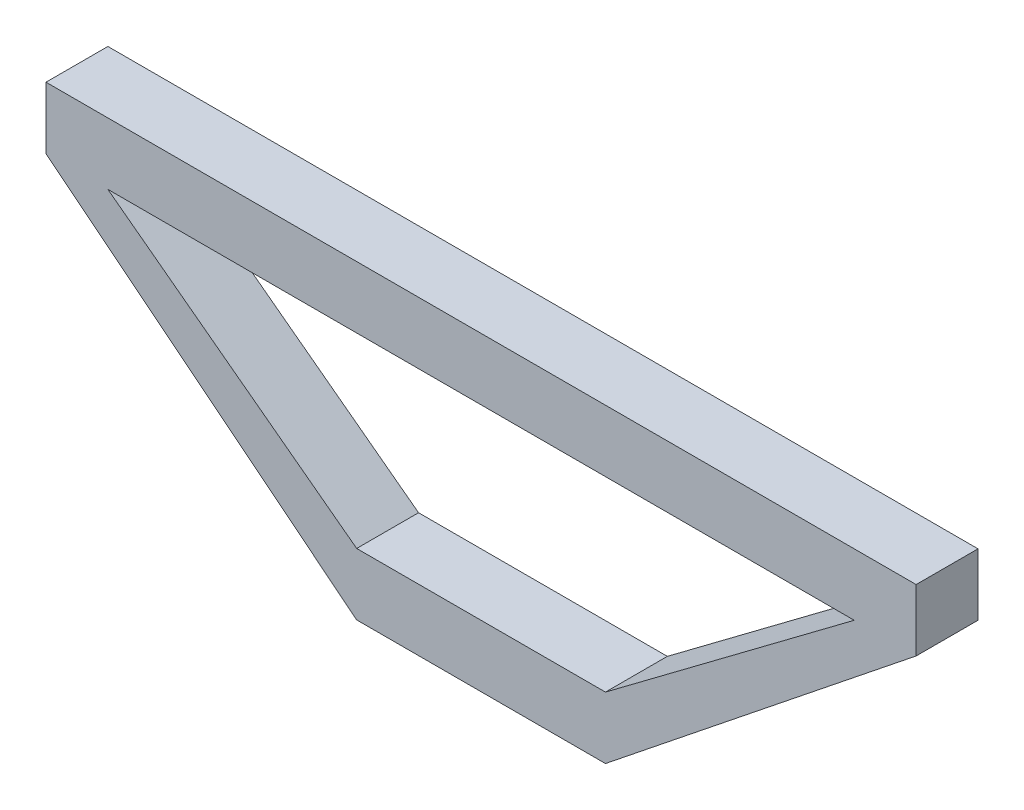
ISO-10303-21;
HEADER;
FILE_DESCRIPTION(('STEP AP214'),'2;1');
FILE_NAME('part.step','',(''),(''),'','','');
FILE_SCHEMA(('AUTOMOTIVE_DESIGN { 1 0 10303 214 1 1 1 1 }'));
ENDSEC;
DATA;
#1=APPLICATION_CONTEXT('core data for automotive mechanical design processes');
#2=APPLICATION_PROTOCOL_DEFINITION('international standard','automotive_design',2000,#1);
#3=PRODUCT_CONTEXT('',#1,'mechanical');
#4=PRODUCT('Part','Part','',(#3));
#5=PRODUCT_RELATED_PRODUCT_CATEGORY('part','',(#4));
#6=PRODUCT_DEFINITION_FORMATION('','',#4);
#7=PRODUCT_DEFINITION_CONTEXT('part definition',#1,'design');
#8=PRODUCT_DEFINITION('design','',#6,#7);
#9=PRODUCT_DEFINITION_SHAPE('','',#8);
#10=(LENGTH_UNIT() NAMED_UNIT(*) SI_UNIT(.MILLI.,.METRE.));
#11=(NAMED_UNIT(*) PLANE_ANGLE_UNIT() SI_UNIT($,.RADIAN.));
#12=(NAMED_UNIT(*) SI_UNIT($,.STERADIAN.) SOLID_ANGLE_UNIT());
#13=UNCERTAINTY_MEASURE_WITH_UNIT(LENGTH_MEASURE(1.E-05),#10,'distance_accuracy_value','');
#14=(GEOMETRIC_REPRESENTATION_CONTEXT(3) GLOBAL_UNCERTAINTY_ASSIGNED_CONTEXT((#13)) GLOBAL_UNIT_ASSIGNED_CONTEXT((#10,
#11,#12)) REPRESENTATION_CONTEXT('',''));
#15=CARTESIAN_POINT('',(0.,0.,0.));
#16=DIRECTION('',(0.,0.,1.));
#17=DIRECTION('',(1.,0.,0.));
#18=AXIS2_PLACEMENT_3D('',#15,#16,#17);
#19=CARTESIAN_POINT('',(0.,0.,99.5));
#20=DIRECTION('',(0.,0.,-1.));
#21=DIRECTION('',(-1.,0.,0.));
#22=AXIS2_PLACEMENT_3D('',#19,#20,#21);
#23=PLANE('',#22);
#24=DIRECTION('',(0.,1.,0.));
#25=VECTOR('',#24,1.);
#26=CARTESIAN_POINT('',(-499.5,300.,99.5));
#27=LINE('',#26,#25);
#28=CARTESIAN_POINT('',(-499.5,300.,99.5));
#29=VERTEX_POINT('',#28);
#30=CARTESIAN_POINT('',(-499.5,399.5,99.5));
#31=VERTEX_POINT('',#30);
#32=EDGE_CURVE('E173',#29,#31,#27,.T.);
#33=ORIENTED_EDGE('',*,*,#32,.F.);
#34=DIRECTION('',(-0.780945069652606,0.624599710362794,0.));
#35=VECTOR('',#34,1.);
#36=CARTESIAN_POINT('',(0.,-99.5,99.5));
#37=LINE('',#36,#35);
#38=CARTESIAN_POINT('',(0.,-99.5,99.5));
#39=VERTEX_POINT('',#38);
#40=EDGE_CURVE('E192',#39,#29,#37,.T.);
#41=ORIENTED_EDGE('',*,*,#40,.F.);
#42=DIRECTION('',(1.,0.,0.));
#43=VECTOR('',#42,1.);
#44=CARTESIAN_POINT('',(0.,-99.5,99.5));
#45=LINE('',#44,#43);
#46=CARTESIAN_POINT('',(400.,-99.5,99.5));
#47=VERTEX_POINT('',#46);
#48=EDGE_CURVE('E189',#39,#47,#45,.T.);
#49=ORIENTED_EDGE('',*,*,#48,.T.);
#50=DIRECTION('',(0.780945069652606,0.624599710362794,0.));
#51=VECTOR('',#50,1.);
#52=CARTESIAN_POINT('',(400.,-99.5,99.5));
#53=LINE('',#52,#51);
#54=CARTESIAN_POINT('',(899.5,300.,99.5));
#55=VERTEX_POINT('',#54);
#56=EDGE_CURVE('E186',#47,#55,#53,.T.);
#57=ORIENTED_EDGE('',*,*,#56,.T.);
#58=DIRECTION('',(0.,-1.,0.));
#59=VECTOR('',#58,1.);
#60=CARTESIAN_POINT('',(899.5,399.5,99.5));
#61=LINE('',#60,#59);
#62=CARTESIAN_POINT('',(899.5,399.5,99.5));
#63=VERTEX_POINT('',#62);
#64=EDGE_CURVE('E182',#63,#55,#61,.T.);
#65=ORIENTED_EDGE('',*,*,#64,.F.);
#66=DIRECTION('',(1.,0.,0.));
#67=VECTOR('',#66,1.);
#68=CARTESIAN_POINT('',(-499.5,399.5,99.5));
#69=LINE('',#68,#67);
#70=EDGE_CURVE('E177',#31,#63,#69,.T.);
#71=ORIENTED_EDGE('',*,*,#70,.F.);
#72=EDGE_LOOP('',(#33,#41,#49,#57,#65,#71));
#73=FACE_BOUND('',#72,.T.);
#74=DIRECTION('',(0.8,-0.6,0.));
#75=VECTOR('',#74,1.);
#76=CARTESIAN_POINT('',(0.,0.,99.5));
#77=LINE('',#76,#75);
#78=CARTESIAN_POINT('',(-400.,300.,99.5));
#79=VERTEX_POINT('',#78);
#80=CARTESIAN_POINT('',(0.,0.,99.5));
#81=VERTEX_POINT('',#80);
#82=EDGE_CURVE('E125',#79,#81,#77,.T.);
#83=ORIENTED_EDGE('',*,*,#82,.F.);
#84=DIRECTION('',(-1.,0.,0.));
#85=VECTOR('',#84,1.);
#86=CARTESIAN_POINT('',(-400.,300.,99.5));
#87=LINE('',#86,#85);
#88=CARTESIAN_POINT('',(800.,300.,99.5));
#89=VERTEX_POINT('',#88);
#90=EDGE_CURVE('E151',#89,#79,#87,.T.);
#91=ORIENTED_EDGE('',*,*,#90,.F.);
#92=DIRECTION('',(0.8,0.6,0.));
#93=VECTOR('',#92,1.);
#94=CARTESIAN_POINT('',(400.,0.,99.5));
#95=LINE('',#94,#93);
#96=CARTESIAN_POINT('',(400.,0.,99.5));
#97=VERTEX_POINT('',#96);
#98=EDGE_CURVE('E147',#97,#89,#95,.T.);
#99=ORIENTED_EDGE('',*,*,#98,.F.);
#100=DIRECTION('',(1.,0.,0.));
#101=VECTOR('',#100,1.);
#102=CARTESIAN_POINT('',(0.,0.,99.5));
#103=LINE('',#102,#101);
#104=EDGE_CURVE('E134',#81,#97,#103,.T.);
#105=ORIENTED_EDGE('',*,*,#104,.F.);
#106=EDGE_LOOP('',(#83,#91,#99,#105));
#107=FACE_BOUND('',#106,.T.);
#108=ADVANCED_FACE('F46',(#73,#107),#23,.F.);
#109=CARTESIAN_POINT('',(0.,0.,0.));
#110=DIRECTION('',(0.,0.,-1.));
#111=DIRECTION('',(-1.,0.,0.));
#112=AXIS2_PLACEMENT_3D('',#109,#110,#111);
#113=PLANE('',#112);
#114=DIRECTION('',(0.,1.,0.));
#115=VECTOR('',#114,1.);
#116=CARTESIAN_POINT('',(-499.5,300.,0.));
#117=LINE('',#116,#115);
#118=CARTESIAN_POINT('',(-499.5,300.,0.));
#119=VERTEX_POINT('',#118);
#120=CARTESIAN_POINT('',(-499.5,399.5,0.));
#121=VERTEX_POINT('',#120);
#122=EDGE_CURVE('E143',#119,#121,#117,.T.);
#123=ORIENTED_EDGE('',*,*,#122,.T.);
#124=DIRECTION('',(1.,0.,0.));
#125=VECTOR('',#124,1.);
#126=CARTESIAN_POINT('',(-499.5,399.5,0.));
#127=LINE('',#126,#125);
#128=CARTESIAN_POINT('',(899.5,399.5,0.));
#129=VERTEX_POINT('',#128);
#130=EDGE_CURVE('E199',#121,#129,#127,.T.);
#131=ORIENTED_EDGE('',*,*,#130,.T.);
#132=DIRECTION('',(0.,-1.,0.));
#133=VECTOR('',#132,1.);
#134=CARTESIAN_POINT('',(899.5,399.5,0.));
#135=LINE('',#134,#133);
#136=CARTESIAN_POINT('',(899.5,300.,0.));
#137=VERTEX_POINT('',#136);
#138=EDGE_CURVE('E203',#129,#137,#135,.T.);
#139=ORIENTED_EDGE('',*,*,#138,.T.);
#140=DIRECTION('',(0.780945069652606,0.624599710362794,0.));
#141=VECTOR('',#140,1.);
#142=CARTESIAN_POINT('',(400.,-99.5,0.));
#143=LINE('',#142,#141);
#144=CARTESIAN_POINT('',(400.,-99.5,0.));
#145=VERTEX_POINT('',#144);
#146=EDGE_CURVE('E207',#145,#137,#143,.T.);
#147=ORIENTED_EDGE('',*,*,#146,.F.);
#148=DIRECTION('',(1.,0.,0.));
#149=VECTOR('',#148,1.);
#150=CARTESIAN_POINT('',(0.,-99.5,0.));
#151=LINE('',#150,#149);
#152=CARTESIAN_POINT('',(0.,-99.5,0.));
#153=VERTEX_POINT('',#152);
#154=EDGE_CURVE('E211',#153,#145,#151,.T.);
#155=ORIENTED_EDGE('',*,*,#154,.F.);
#156=DIRECTION('',(-0.780945069652606,0.624599710362794,0.));
#157=VECTOR('',#156,1.);
#158=CARTESIAN_POINT('',(0.,-99.5,0.));
#159=LINE('',#158,#157);
#160=EDGE_CURVE('E178',#153,#119,#159,.T.);
#161=ORIENTED_EDGE('',*,*,#160,.T.);
#162=EDGE_LOOP('',(#123,#131,#139,#147,#155,#161));
#163=FACE_BOUND('',#162,.T.);
#164=DIRECTION('',(-1.,0.,0.));
#165=VECTOR('',#164,1.);
#166=CARTESIAN_POINT('',(-400.,300.,0.));
#167=LINE('',#166,#165);
#168=CARTESIAN_POINT('',(800.,300.,0.));
#169=VERTEX_POINT('',#168);
#170=CARTESIAN_POINT('',(-400.,300.,0.));
#171=VERTEX_POINT('',#170);
#172=EDGE_CURVE('E135',#169,#171,#167,.T.);
#173=ORIENTED_EDGE('',*,*,#172,.T.);
#174=DIRECTION('',(0.8,-0.6,0.));
#175=VECTOR('',#174,1.);
#176=CARTESIAN_POINT('',(0.,0.,0.));
#177=LINE('',#176,#175);
#178=CARTESIAN_POINT('',(0.,0.,0.));
#179=VERTEX_POINT('',#178);
#180=EDGE_CURVE('E72',#171,#179,#177,.T.);
#181=ORIENTED_EDGE('',*,*,#180,.T.);
#182=DIRECTION('',(1.,0.,0.));
#183=VECTOR('',#182,1.);
#184=CARTESIAN_POINT('',(0.,0.,0.));
#185=LINE('',#184,#183);
#186=CARTESIAN_POINT('',(400.,0.,0.));
#187=VERTEX_POINT('',#186);
#188=EDGE_CURVE('E141',#179,#187,#185,.T.);
#189=ORIENTED_EDGE('',*,*,#188,.T.);
#190=DIRECTION('',(0.8,0.6,0.));
#191=VECTOR('',#190,1.);
#192=CARTESIAN_POINT('',(400.,0.,0.));
#193=LINE('',#192,#191);
#194=EDGE_CURVE('E160',#187,#169,#193,.T.);
#195=ORIENTED_EDGE('',*,*,#194,.T.);
#196=EDGE_LOOP('',(#173,#181,#189,#195));
#197=FACE_BOUND('',#196,.T.);
#198=ADVANCED_FACE('F237',(#163,#197),#113,.T.);
#199=CARTESIAN_POINT('',(-499.5,300.,99.5));
#200=DIRECTION('',(-1.,0.,0.));
#201=DIRECTION('',(0.,0.,1.));
#202=AXIS2_PLACEMENT_3D('',#199,#200,#201);
#203=PLANE('',#202);
#204=ORIENTED_EDGE('',*,*,#122,.F.);
#205=DIRECTION('',(0.,0.,-1.));
#206=VECTOR('',#205,1.);
#207=CARTESIAN_POINT('',(-499.5,300.,99.5));
#208=LINE('',#207,#206);
#209=EDGE_CURVE('E12',#29,#119,#208,.T.);
#210=ORIENTED_EDGE('',*,*,#209,.F.);
#211=ORIENTED_EDGE('',*,*,#32,.T.);
#212=DIRECTION('',(0.,0.,-1.));
#213=VECTOR('',#212,1.);
#214=CARTESIAN_POINT('',(-499.5,399.5,99.5));
#215=LINE('',#214,#213);
#216=EDGE_CURVE('E50',#31,#121,#215,.T.);
#217=ORIENTED_EDGE('',*,*,#216,.T.);
#218=EDGE_LOOP('',(#204,#210,#211,#217));
#219=FACE_BOUND('',#218,.T.);
#220=ADVANCED_FACE('F48',(#219),#203,.T.);
#221=CARTESIAN_POINT('',(0.,-99.5,99.5));
#222=DIRECTION('',(-0.624599710362794,-0.780945069652606,0.));
#223=DIRECTION('',(0.780945069652606,-0.624599710362794,0.));
#224=AXIS2_PLACEMENT_3D('',#221,#222,#223);
#225=PLANE('',#224);
#226=ORIENTED_EDGE('',*,*,#160,.F.);
#227=DIRECTION('',(0.,0.,-1.));
#228=VECTOR('',#227,1.);
#229=CARTESIAN_POINT('',(0.,-99.5,99.5));
#230=LINE('',#229,#228);
#231=EDGE_CURVE('E56',#39,#153,#230,.T.);
#232=ORIENTED_EDGE('',*,*,#231,.F.);
#233=ORIENTED_EDGE('',*,*,#40,.T.);
#234=ORIENTED_EDGE('',*,*,#209,.T.);
#235=EDGE_LOOP('',(#226,#232,#233,#234));
#236=FACE_BOUND('',#235,.T.);
#237=ADVANCED_FACE('F243',(#236),#225,.T.);
#238=CARTESIAN_POINT('',(0.,-99.5,99.5));
#239=DIRECTION('',(0.,1.,0.));
#240=DIRECTION('',(0.,0.,1.));
#241=AXIS2_PLACEMENT_3D('',#238,#239,#240);
#242=PLANE('',#241);
#243=ORIENTED_EDGE('',*,*,#154,.T.);
#244=DIRECTION('',(0.,0.,-1.));
#245=VECTOR('',#244,1.);
#246=CARTESIAN_POINT('',(400.,-99.5,99.5));
#247=LINE('',#246,#245);
#248=EDGE_CURVE('E219',#47,#145,#247,.T.);
#249=ORIENTED_EDGE('',*,*,#248,.F.);
#250=ORIENTED_EDGE('',*,*,#48,.F.);
#251=ORIENTED_EDGE('',*,*,#231,.T.);
#252=EDGE_LOOP('',(#243,#249,#250,#251));
#253=FACE_BOUND('',#252,.T.);
#254=ADVANCED_FACE('F256',(#253),#242,.F.);
#255=CARTESIAN_POINT('',(400.,-99.5,99.5));
#256=DIRECTION('',(-0.624599710362794,0.780945069652606,0.));
#257=DIRECTION('',(-0.780945069652606,-0.624599710362794,0.));
#258=AXIS2_PLACEMENT_3D('',#255,#256,#257);
#259=PLANE('',#258);
#260=ORIENTED_EDGE('',*,*,#146,.T.);
#261=DIRECTION('',(0.,0.,-1.));
#262=VECTOR('',#261,1.);
#263=CARTESIAN_POINT('',(899.5,300.,99.5));
#264=LINE('',#263,#262);
#265=EDGE_CURVE('E223',#55,#137,#264,.T.);
#266=ORIENTED_EDGE('',*,*,#265,.F.);
#267=ORIENTED_EDGE('',*,*,#56,.F.);
#268=ORIENTED_EDGE('',*,*,#248,.T.);
#269=EDGE_LOOP('',(#260,#266,#267,#268));
#270=FACE_BOUND('',#269,.T.);
#271=ADVANCED_FACE('F253',(#270),#259,.F.);
#272=CARTESIAN_POINT('',(899.5,399.5,99.5));
#273=DIRECTION('',(1.,0.,0.));
#274=DIRECTION('',(0.,0.,-1.));
#275=AXIS2_PLACEMENT_3D('',#272,#273,#274);
#276=PLANE('',#275);
#277=ORIENTED_EDGE('',*,*,#138,.F.);
#278=DIRECTION('',(0.,0.,-1.));
#279=VECTOR('',#278,1.);
#280=CARTESIAN_POINT('',(899.5,399.5,99.5));
#281=LINE('',#280,#279);
#282=EDGE_CURVE('E225',#63,#129,#281,.T.);
#283=ORIENTED_EDGE('',*,*,#282,.F.);
#284=ORIENTED_EDGE('',*,*,#64,.T.);
#285=ORIENTED_EDGE('',*,*,#265,.T.);
#286=EDGE_LOOP('',(#277,#283,#284,#285));
#287=FACE_BOUND('',#286,.T.);
#288=ADVANCED_FACE('F251',(#287),#276,.T.);
#289=CARTESIAN_POINT('',(-499.5,399.5,99.5));
#290=DIRECTION('',(0.,1.,0.));
#291=DIRECTION('',(0.,0.,1.));
#292=AXIS2_PLACEMENT_3D('',#289,#290,#291);
#293=PLANE('',#292);
#294=ORIENTED_EDGE('',*,*,#130,.F.);
#295=ORIENTED_EDGE('',*,*,#216,.F.);
#296=ORIENTED_EDGE('',*,*,#70,.T.);
#297=ORIENTED_EDGE('',*,*,#282,.T.);
#298=EDGE_LOOP('',(#294,#295,#296,#297));
#299=FACE_BOUND('',#298,.T.);
#300=ADVANCED_FACE('F235',(#299),#293,.T.);
#301=CARTESIAN_POINT('',(0.,0.,99.5));
#302=DIRECTION('',(0.6,0.8,0.));
#303=DIRECTION('',(-0.8,0.6,0.));
#304=AXIS2_PLACEMENT_3D('',#301,#302,#303);
#305=PLANE('',#304);
#306=ORIENTED_EDGE('',*,*,#180,.F.);
#307=DIRECTION('',(0.,0.,-1.));
#308=VECTOR('',#307,1.);
#309=CARTESIAN_POINT('',(-400.,300.,99.5));
#310=LINE('',#309,#308);
#311=EDGE_CURVE('E129',#79,#171,#310,.T.);
#312=ORIENTED_EDGE('',*,*,#311,.F.);
#313=ORIENTED_EDGE('',*,*,#82,.T.);
#314=DIRECTION('',(0.,0.,-1.));
#315=VECTOR('',#314,1.);
#316=CARTESIAN_POINT('',(0.,0.,99.5));
#317=LINE('',#316,#315);
#318=EDGE_CURVE('E128',#81,#179,#317,.T.);
#319=ORIENTED_EDGE('',*,*,#318,.T.);
#320=EDGE_LOOP('',(#306,#312,#313,#319));
#321=FACE_BOUND('',#320,.T.);
#322=ADVANCED_FACE('F127',(#321),#305,.T.);
#323=CARTESIAN_POINT('',(0.,0.,99.5));
#324=DIRECTION('',(0.,1.,0.));
#325=DIRECTION('',(0.,0.,1.));
#326=AXIS2_PLACEMENT_3D('',#323,#324,#325);
#327=PLANE('',#326);
#328=ORIENTED_EDGE('',*,*,#188,.F.);
#329=ORIENTED_EDGE('',*,*,#318,.F.);
#330=ORIENTED_EDGE('',*,*,#104,.T.);
#331=DIRECTION('',(0.,0.,-1.));
#332=VECTOR('',#331,1.);
#333=CARTESIAN_POINT('',(400.,0.,99.5));
#334=LINE('',#333,#332);
#335=EDGE_CURVE('E144',#97,#187,#334,.T.);
#336=ORIENTED_EDGE('',*,*,#335,.T.);
#337=EDGE_LOOP('',(#328,#329,#330,#336));
#338=FACE_BOUND('',#337,.T.);
#339=ADVANCED_FACE('F138',(#338),#327,.T.);
#340=CARTESIAN_POINT('',(400.,0.,99.5));
#341=DIRECTION('',(-0.6,0.8,0.));
#342=DIRECTION('',(-0.8,-0.6,0.));
#343=AXIS2_PLACEMENT_3D('',#340,#341,#342);
#344=PLANE('',#343);
#345=ORIENTED_EDGE('',*,*,#194,.F.);
#346=ORIENTED_EDGE('',*,*,#335,.F.);
#347=ORIENTED_EDGE('',*,*,#98,.T.);
#348=DIRECTION('',(0.,0.,-1.));
#349=VECTOR('',#348,1.);
#350=CARTESIAN_POINT('',(800.,300.,99.5));
#351=LINE('',#350,#349);
#352=EDGE_CURVE('E64',#89,#169,#351,.T.);
#353=ORIENTED_EDGE('',*,*,#352,.T.);
#354=EDGE_LOOP('',(#345,#346,#347,#353));
#355=FACE_BOUND('',#354,.T.);
#356=ADVANCED_FACE('F277',(#355),#344,.T.);
#357=CARTESIAN_POINT('',(-400.,300.,99.5));
#358=DIRECTION('',(0.,-1.,0.));
#359=DIRECTION('',(1.,0.,0.));
#360=AXIS2_PLACEMENT_3D('',#357,#358,#359);
#361=PLANE('',#360);
#362=ORIENTED_EDGE('',*,*,#172,.F.);
#363=ORIENTED_EDGE('',*,*,#352,.F.);
#364=ORIENTED_EDGE('',*,*,#90,.T.);
#365=ORIENTED_EDGE('',*,*,#311,.T.);
#366=EDGE_LOOP('',(#362,#363,#364,#365));
#367=FACE_BOUND('',#366,.T.);
#368=ADVANCED_FACE('F280',(#367),#361,.T.);
#369=CLOSED_SHELL('',(#108,#198,#220,#237,#254,#271,#288,#300,#322,#339,#356,#368));
#370=MANIFOLD_SOLID_BREP('B2',#369);
#371=ADVANCED_BREP_SHAPE_REPRESENTATION('',(#18,#370),#14);
#372=SHAPE_DEFINITION_REPRESENTATION(#9,#371);
ENDSEC;
END-ISO-10303-21;
